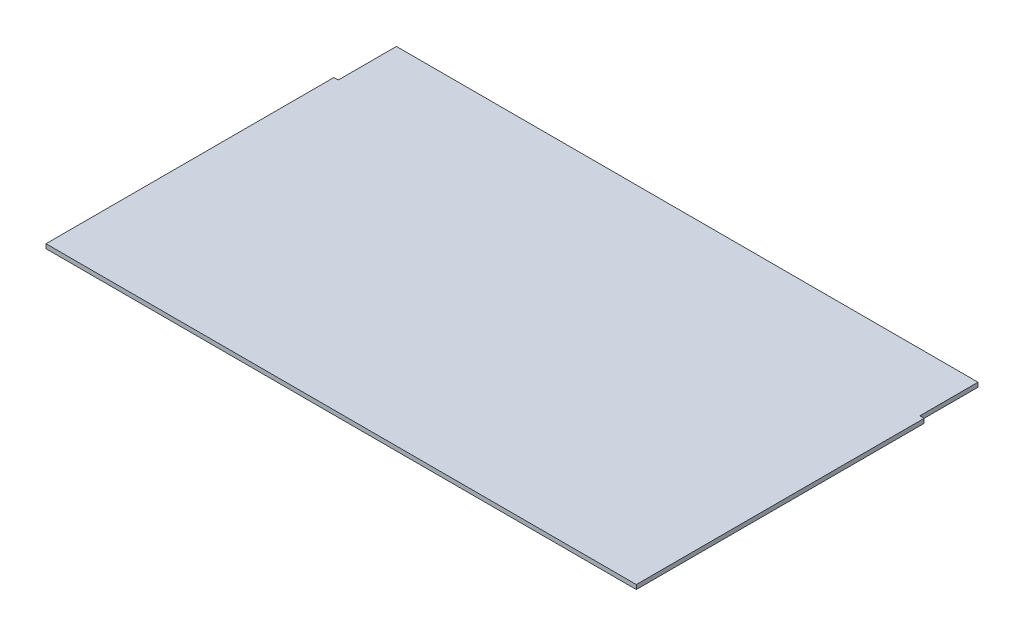
ISO-10303-21;
HEADER;
FILE_DESCRIPTION(('STEP AP214'),'2;1');
FILE_NAME('part.step','',(''),(''),'','','');
FILE_SCHEMA(('AUTOMOTIVE_DESIGN { 1 0 10303 214 1 1 1 1 }'));
ENDSEC;
DATA;
#1=APPLICATION_CONTEXT('core data for automotive mechanical design processes');
#2=APPLICATION_PROTOCOL_DEFINITION('international standard','automotive_design',2000,#1);
#3=PRODUCT_CONTEXT('',#1,'mechanical');
#4=PRODUCT('Part','Part','',(#3));
#5=PRODUCT_RELATED_PRODUCT_CATEGORY('part','',(#4));
#6=PRODUCT_DEFINITION_FORMATION('','',#4);
#7=PRODUCT_DEFINITION_CONTEXT('part definition',#1,'design');
#8=PRODUCT_DEFINITION('design','',#6,#7);
#9=PRODUCT_DEFINITION_SHAPE('','',#8);
#10=(LENGTH_UNIT() NAMED_UNIT(*) SI_UNIT(.MILLI.,.METRE.));
#11=(NAMED_UNIT(*) PLANE_ANGLE_UNIT() SI_UNIT($,.RADIAN.));
#12=(NAMED_UNIT(*) SI_UNIT($,.STERADIAN.) SOLID_ANGLE_UNIT());
#13=UNCERTAINTY_MEASURE_WITH_UNIT(LENGTH_MEASURE(1.E-05),#10,'distance_accuracy_value','');
#14=(GEOMETRIC_REPRESENTATION_CONTEXT(3) GLOBAL_UNCERTAINTY_ASSIGNED_CONTEXT((#13)) GLOBAL_UNIT_ASSIGNED_CONTEXT((#10,
#11,#12)) REPRESENTATION_CONTEXT('',''));
#15=CARTESIAN_POINT('',(0.,0.,0.));
#16=DIRECTION('',(0.,0.,1.));
#17=DIRECTION('',(1.,0.,0.));
#18=AXIS2_PLACEMENT_3D('',#15,#16,#17);
#19=CARTESIAN_POINT('',(-203.,3.,-99.));
#20=DIRECTION('',(0.,0.,1.));
#21=DIRECTION('',(1.,0.,0.));
#22=AXIS2_PLACEMENT_3D('',#19,#20,#21);
#23=PLANE('',#22);
#24=DIRECTION('',(0.,1.,0.));
#25=VECTOR('',#24,1.);
#26=CARTESIAN_POINT('',(-200.,-401.995024844836,-99.));
#27=LINE('',#26,#25);
#28=CARTESIAN_POINT('',(-200.,0.,-99.));
#29=VERTEX_POINT('',#28);
#30=CARTESIAN_POINT('',(-200.,3.,-99.));
#31=VERTEX_POINT('',#30);
#32=EDGE_CURVE('E149',#29,#31,#27,.T.);
#33=ORIENTED_EDGE('',*,*,#32,.F.);
#34=DIRECTION('',(-1.,0.,0.));
#35=VECTOR('',#34,1.);
#36=CARTESIAN_POINT('',(-203.,0.,-99.));
#37=LINE('',#36,#35);
#38=CARTESIAN_POINT('',(-203.,0.,-99.));
#39=VERTEX_POINT('',#38);
#40=EDGE_CURVE('E125',#29,#39,#37,.T.);
#41=ORIENTED_EDGE('',*,*,#40,.T.);
#42=DIRECTION('',(0.,-1.,0.));
#43=VECTOR('',#42,1.);
#44=CARTESIAN_POINT('',(-203.,3.,-99.));
#45=LINE('',#44,#43);
#46=CARTESIAN_POINT('',(-203.,3.,-99.));
#47=VERTEX_POINT('',#46);
#48=EDGE_CURVE('E41',#47,#39,#45,.T.);
#49=ORIENTED_EDGE('',*,*,#48,.F.);
#50=DIRECTION('',(-1.,0.,0.));
#51=VECTOR('',#50,1.);
#52=CARTESIAN_POINT('',(-203.,3.,-99.));
#53=LINE('',#52,#51);
#54=EDGE_CURVE('E161',#31,#47,#53,.T.);
#55=ORIENTED_EDGE('',*,*,#54,.F.);
#56=EDGE_LOOP('',(#33,#41,#49,#55));
#57=FACE_BOUND('',#56,.T.);
#58=ADVANCED_FACE('F33',(#57),#23,.F.);
#59=CARTESIAN_POINT('',(203.,3.,99.));
#60=DIRECTION('',(-1.,0.,0.));
#61=DIRECTION('',(0.,0.,1.));
#62=AXIS2_PLACEMENT_3D('',#59,#60,#61);
#63=PLANE('',#62);
#64=DIRECTION('',(0.,0.,-1.));
#65=VECTOR('',#64,1.);
#66=CARTESIAN_POINT('',(203.,0.,99.));
#67=LINE('',#66,#65);
#68=CARTESIAN_POINT('',(203.,0.,99.));
#69=VERTEX_POINT('',#68);
#70=CARTESIAN_POINT('',(203.,0.,-99.));
#71=VERTEX_POINT('',#70);
#72=EDGE_CURVE('E128',#69,#71,#67,.T.);
#73=ORIENTED_EDGE('',*,*,#72,.T.);
#74=DIRECTION('',(0.,-1.,0.));
#75=VECTOR('',#74,1.);
#76=CARTESIAN_POINT('',(203.,3.,-99.));
#77=LINE('',#76,#75);
#78=CARTESIAN_POINT('',(203.,3.,-99.));
#79=VERTEX_POINT('',#78);
#80=EDGE_CURVE('E11',#79,#71,#77,.T.);
#81=ORIENTED_EDGE('',*,*,#80,.F.);
#82=DIRECTION('',(0.,0.,-1.));
#83=VECTOR('',#82,1.);
#84=CARTESIAN_POINT('',(203.,3.,99.));
#85=LINE('',#84,#83);
#86=CARTESIAN_POINT('',(203.,3.,99.));
#87=VERTEX_POINT('',#86);
#88=EDGE_CURVE('E133',#87,#79,#85,.T.);
#89=ORIENTED_EDGE('',*,*,#88,.F.);
#90=DIRECTION('',(0.,-1.,0.));
#91=VECTOR('',#90,1.);
#92=CARTESIAN_POINT('',(203.,3.,99.));
#93=LINE('',#92,#91);
#94=EDGE_CURVE('E134',#87,#69,#93,.T.);
#95=ORIENTED_EDGE('',*,*,#94,.T.);
#96=EDGE_LOOP('',(#73,#81,#89,#95));
#97=FACE_BOUND('',#96,.T.);
#98=ADVANCED_FACE('F35',(#97),#63,.F.);
#99=CARTESIAN_POINT('',(200.,-1.11022302462516E-13,-99.));
#100=VERTEX_POINT('',#99);
#101=EDGE_CURVE('E111',#71,#100,#37,.T.);
#102=ORIENTED_EDGE('',*,*,#101,.T.);
#103=DIRECTION('',(0.,1.,0.));
#104=VECTOR('',#103,1.);
#105=CARTESIAN_POINT('',(200.,-401.995024844836,-99.));
#106=LINE('',#105,#104);
#107=CARTESIAN_POINT('',(200.,3.,-99.));
#108=VERTEX_POINT('',#107);
#109=EDGE_CURVE('E116',#100,#108,#106,.T.);
#110=ORIENTED_EDGE('',*,*,#109,.T.);
#111=EDGE_CURVE('E84',#79,#108,#53,.T.);
#112=ORIENTED_EDGE('',*,*,#111,.F.);
#113=ORIENTED_EDGE('',*,*,#80,.T.);
#114=EDGE_LOOP('',(#102,#110,#112,#113));
#115=FACE_BOUND('',#114,.T.);
#116=ADVANCED_FACE('F121',(#115),#23,.F.);
#117=CARTESIAN_POINT('',(-203.,3.,99.));
#118=DIRECTION('',(1.,0.,0.));
#119=DIRECTION('',(0.,0.,-1.));
#120=AXIS2_PLACEMENT_3D('',#117,#118,#119);
#121=PLANE('',#120);
#122=DIRECTION('',(0.,0.,1.));
#123=VECTOR('',#122,1.);
#124=CARTESIAN_POINT('',(-203.,0.,99.));
#125=LINE('',#124,#123);
#126=CARTESIAN_POINT('',(-203.,0.,99.));
#127=VERTEX_POINT('',#126);
#128=EDGE_CURVE('E124',#39,#127,#125,.T.);
#129=ORIENTED_EDGE('',*,*,#128,.T.);
#130=DIRECTION('',(0.,-1.,0.));
#131=VECTOR('',#130,1.);
#132=CARTESIAN_POINT('',(-203.,3.,99.));
#133=LINE('',#132,#131);
#134=CARTESIAN_POINT('',(-203.,3.,99.));
#135=VERTEX_POINT('',#134);
#136=EDGE_CURVE('E136',#135,#127,#133,.T.);
#137=ORIENTED_EDGE('',*,*,#136,.F.);
#138=DIRECTION('',(0.,0.,1.));
#139=VECTOR('',#138,1.);
#140=CARTESIAN_POINT('',(-203.,3.,99.));
#141=LINE('',#140,#139);
#142=EDGE_CURVE('E144',#47,#135,#141,.T.);
#143=ORIENTED_EDGE('',*,*,#142,.F.);
#144=ORIENTED_EDGE('',*,*,#48,.T.);
#145=EDGE_LOOP('',(#129,#137,#143,#144));
#146=FACE_BOUND('',#145,.T.);
#147=ADVANCED_FACE('F142',(#146),#121,.F.);
#148=CARTESIAN_POINT('',(-203.,3.,99.));
#149=DIRECTION('',(0.,0.,-1.));
#150=DIRECTION('',(-1.,0.,0.));
#151=AXIS2_PLACEMENT_3D('',#148,#149,#150);
#152=PLANE('',#151);
#153=DIRECTION('',(1.,0.,0.));
#154=VECTOR('',#153,1.);
#155=CARTESIAN_POINT('',(-203.,0.,99.));
#156=LINE('',#155,#154);
#157=EDGE_CURVE('E78',#127,#69,#156,.T.);
#158=ORIENTED_EDGE('',*,*,#157,.T.);
#159=ORIENTED_EDGE('',*,*,#94,.F.);
#160=DIRECTION('',(1.,0.,0.));
#161=VECTOR('',#160,1.);
#162=CARTESIAN_POINT('',(-203.,3.,99.));
#163=LINE('',#162,#161);
#164=EDGE_CURVE('E57',#135,#87,#163,.T.);
#165=ORIENTED_EDGE('',*,*,#164,.F.);
#166=ORIENTED_EDGE('',*,*,#136,.T.);
#167=EDGE_LOOP('',(#158,#159,#165,#166));
#168=FACE_BOUND('',#167,.T.);
#169=ADVANCED_FACE('F164',(#168),#152,.F.);
#170=CARTESIAN_POINT('',(0.,3.,0.));
#171=DIRECTION('',(0.,-1.,0.));
#172=DIRECTION('',(0.,0.,-1.));
#173=AXIS2_PLACEMENT_3D('',#170,#171,#172);
#174=PLANE('',#173);
#175=ORIENTED_EDGE('',*,*,#88,.T.);
#176=ORIENTED_EDGE('',*,*,#111,.T.);
#177=DIRECTION('',(0.,0.,-1.));
#178=VECTOR('',#177,1.);
#179=CARTESIAN_POINT('',(200.,3.,-99.));
#180=LINE('',#179,#178);
#181=CARTESIAN_POINT('',(200.,3.,-139.));
#182=VERTEX_POINT('',#181);
#183=EDGE_CURVE('E48',#108,#182,#180,.T.);
#184=ORIENTED_EDGE('',*,*,#183,.T.);
#185=DIRECTION('',(-1.,0.,0.));
#186=VECTOR('',#185,1.);
#187=CARTESIAN_POINT('',(-200.,3.,-139.));
#188=LINE('',#187,#186);
#189=CARTESIAN_POINT('',(-200.,3.,-139.));
#190=VERTEX_POINT('',#189);
#191=EDGE_CURVE('E119',#182,#190,#188,.T.);
#192=ORIENTED_EDGE('',*,*,#191,.T.);
#193=DIRECTION('',(0.,0.,1.));
#194=VECTOR('',#193,1.);
#195=CARTESIAN_POINT('',(-200.,3.,-99.));
#196=LINE('',#195,#194);
#197=EDGE_CURVE('E168',#190,#31,#196,.T.);
#198=ORIENTED_EDGE('',*,*,#197,.T.);
#199=ORIENTED_EDGE('',*,*,#54,.T.);
#200=ORIENTED_EDGE('',*,*,#142,.T.);
#201=ORIENTED_EDGE('',*,*,#164,.T.);
#202=EDGE_LOOP('',(#175,#176,#184,#192,#198,#199,#200,#201));
#203=FACE_BOUND('',#202,.T.);
#204=ADVANCED_FACE('F163',(#203),#174,.F.);
#205=CARTESIAN_POINT('',(0.,0.,0.));
#206=DIRECTION('',(0.,-1.,0.));
#207=DIRECTION('',(0.,0.,-1.));
#208=AXIS2_PLACEMENT_3D('',#205,#206,#207);
#209=PLANE('',#208);
#210=ORIENTED_EDGE('',*,*,#72,.F.);
#211=ORIENTED_EDGE('',*,*,#157,.F.);
#212=ORIENTED_EDGE('',*,*,#128,.F.);
#213=ORIENTED_EDGE('',*,*,#40,.F.);
#214=DIRECTION('',(0.,0.,1.));
#215=VECTOR('',#214,1.);
#216=CARTESIAN_POINT('',(-200.,0.,-99.));
#217=LINE('',#216,#215);
#218=CARTESIAN_POINT('',(-200.,0.,-139.));
#219=VERTEX_POINT('',#218);
#220=EDGE_CURVE('E150',#219,#29,#217,.T.);
#221=ORIENTED_EDGE('',*,*,#220,.F.);
#222=DIRECTION('',(-1.,0.,0.));
#223=VECTOR('',#222,1.);
#224=CARTESIAN_POINT('',(-200.,0.,-139.));
#225=LINE('',#224,#223);
#226=CARTESIAN_POINT('',(200.,0.,-139.));
#227=VERTEX_POINT('',#226);
#228=EDGE_CURVE('E113',#227,#219,#225,.T.);
#229=ORIENTED_EDGE('',*,*,#228,.F.);
#230=DIRECTION('',(0.,0.,-1.));
#231=VECTOR('',#230,1.);
#232=CARTESIAN_POINT('',(200.,0.,-99.));
#233=LINE('',#232,#231);
#234=EDGE_CURVE('E107',#100,#227,#233,.T.);
#235=ORIENTED_EDGE('',*,*,#234,.F.);
#236=ORIENTED_EDGE('',*,*,#101,.F.);
#237=EDGE_LOOP('',(#210,#211,#212,#213,#221,#229,#235,#236));
#238=FACE_BOUND('',#237,.T.);
#239=ADVANCED_FACE('F109',(#238),#209,.T.);
#240=CARTESIAN_POINT('',(200.,-401.995024844836,-99.));
#241=DIRECTION('',(1.,0.,0.));
#242=DIRECTION('',(0.,0.,-1.));
#243=AXIS2_PLACEMENT_3D('',#240,#241,#242);
#244=PLANE('',#243);
#245=ORIENTED_EDGE('',*,*,#109,.F.);
#246=ORIENTED_EDGE('',*,*,#234,.T.);
#247=DIRECTION('',(0.,1.,0.));
#248=VECTOR('',#247,1.);
#249=CARTESIAN_POINT('',(200.,-401.995024844836,-139.));
#250=LINE('',#249,#248);
#251=EDGE_CURVE('E115',#227,#182,#250,.T.);
#252=ORIENTED_EDGE('',*,*,#251,.T.);
#253=ORIENTED_EDGE('',*,*,#183,.F.);
#254=EDGE_LOOP('',(#245,#246,#252,#253));
#255=FACE_BOUND('',#254,.T.);
#256=ADVANCED_FACE('F118',(#255),#244,.T.);
#257=CARTESIAN_POINT('',(-200.,-401.995024844836,-139.));
#258=DIRECTION('',(0.,0.,-1.));
#259=DIRECTION('',(-1.,0.,0.));
#260=AXIS2_PLACEMENT_3D('',#257,#258,#259);
#261=PLANE('',#260);
#262=ORIENTED_EDGE('',*,*,#251,.F.);
#263=ORIENTED_EDGE('',*,*,#228,.T.);
#264=DIRECTION('',(0.,1.,0.));
#265=VECTOR('',#264,1.);
#266=CARTESIAN_POINT('',(-200.,-401.995024844836,-139.));
#267=LINE('',#266,#265);
#268=EDGE_CURVE('E156',#219,#190,#267,.T.);
#269=ORIENTED_EDGE('',*,*,#268,.T.);
#270=ORIENTED_EDGE('',*,*,#191,.F.);
#271=EDGE_LOOP('',(#262,#263,#269,#270));
#272=FACE_BOUND('',#271,.T.);
#273=ADVANCED_FACE('F171',(#272),#261,.T.);
#274=CARTESIAN_POINT('',(-200.,-401.995024844836,-99.));
#275=DIRECTION('',(-1.,0.,0.));
#276=DIRECTION('',(0.,0.,1.));
#277=AXIS2_PLACEMENT_3D('',#274,#275,#276);
#278=PLANE('',#277);
#279=ORIENTED_EDGE('',*,*,#268,.F.);
#280=ORIENTED_EDGE('',*,*,#220,.T.);
#281=ORIENTED_EDGE('',*,*,#32,.T.);
#282=ORIENTED_EDGE('',*,*,#197,.F.);
#283=EDGE_LOOP('',(#279,#280,#281,#282));
#284=FACE_BOUND('',#283,.T.);
#285=ADVANCED_FACE('F199',(#284),#278,.T.);
#286=CLOSED_SHELL('',(#58,#98,#116,#147,#169,#204,#239,#256,#273,#285));
#287=MANIFOLD_SOLID_BREP('B2',#286);
#288=ADVANCED_BREP_SHAPE_REPRESENTATION('',(#18,#287),#14);
#289=SHAPE_DEFINITION_REPRESENTATION(#9,#288);
ENDSEC;
END-ISO-10303-21;
